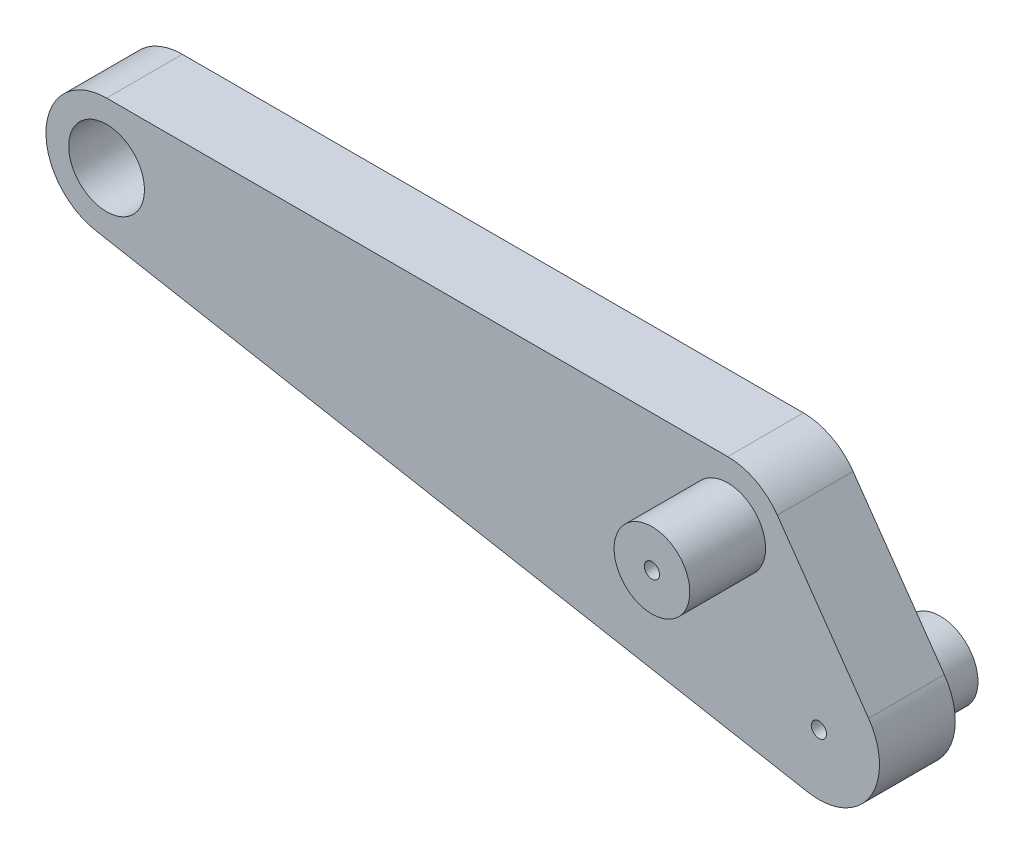
ISO-10303-21;
HEADER;
FILE_DESCRIPTION(('STEP AP214'),'2;1');
FILE_NAME('part.step','',(''),(''),'','','');
FILE_SCHEMA(('AUTOMOTIVE_DESIGN { 1 0 10303 214 1 1 1 1 }'));
ENDSEC;
DATA;
#1=APPLICATION_CONTEXT('core data for automotive mechanical design processes');
#2=APPLICATION_PROTOCOL_DEFINITION('international standard','automotive_design',2000,#1);
#3=PRODUCT_CONTEXT('',#1,'mechanical');
#4=PRODUCT('Part','Part','',(#3));
#5=PRODUCT_RELATED_PRODUCT_CATEGORY('part','',(#4));
#6=PRODUCT_DEFINITION_FORMATION('','',#4);
#7=PRODUCT_DEFINITION_CONTEXT('part definition',#1,'design');
#8=PRODUCT_DEFINITION('design','',#6,#7);
#9=PRODUCT_DEFINITION_SHAPE('','',#8);
#10=(LENGTH_UNIT() NAMED_UNIT(*) SI_UNIT(.MILLI.,.METRE.));
#11=(NAMED_UNIT(*) PLANE_ANGLE_UNIT() SI_UNIT($,.RADIAN.));
#12=(NAMED_UNIT(*) SI_UNIT($,.STERADIAN.) SOLID_ANGLE_UNIT());
#13=UNCERTAINTY_MEASURE_WITH_UNIT(LENGTH_MEASURE(1.E-05),#10,'distance_accuracy_value','');
#14=(GEOMETRIC_REPRESENTATION_CONTEXT(3) GLOBAL_UNCERTAINTY_ASSIGNED_CONTEXT((#13)) GLOBAL_UNIT_ASSIGNED_CONTEXT((#10,
#11,#12)) REPRESENTATION_CONTEXT('',''));
#15=CARTESIAN_POINT('',(0.,0.,0.));
#16=DIRECTION('',(0.,0.,1.));
#17=DIRECTION('',(1.,0.,0.));
#18=AXIS2_PLACEMENT_3D('',#15,#16,#17);
#19=CARTESIAN_POINT('',(0.,0.,5.));
#20=DIRECTION('',(0.,0.,1.));
#21=DIRECTION('',(1.,0.,0.));
#22=AXIS2_PLACEMENT_3D('',#19,#20,#21);
#23=PLANE('',#22);
#24=CARTESIAN_POINT('',(0.,0.,5.));
#25=DIRECTION('',(0.,0.,1.));
#26=DIRECTION('',(1.,0.,0.));
#27=AXIS2_PLACEMENT_3D('',#24,#25,#26);
#28=CIRCLE('',#27,2.5);
#29=CARTESIAN_POINT('',(2.5,0.,5.));
#30=VERTEX_POINT('',#29);
#31=EDGE_CURVE('E215',#30,#30,#28,.T.);
#32=ORIENTED_EDGE('',*,*,#31,.F.);
#33=EDGE_LOOP('',(#32));
#34=FACE_BOUND('',#33,.T.);
#35=CARTESIAN_POINT('',(0.,0.,5.));
#36=DIRECTION('',(0.,0.,1.));
#37=DIRECTION('',(1.,0.,0.));
#38=AXIS2_PLACEMENT_3D('',#35,#36,#37);
#39=CIRCLE('',#38,4.);
#40=CARTESIAN_POINT('',(3.27660817715596,2.2943057454042,5.));
#41=VERTEX_POINT('',#40);
#42=CARTESIAN_POINT('',(0.,4.,5.));
#43=VERTEX_POINT('',#42);
#44=EDGE_CURVE('E130',#41,#43,#39,.T.);
#45=ORIENTED_EDGE('',*,*,#44,.T.);
#46=DIRECTION('',(-1.,0.,0.));
#47=VECTOR('',#46,1.);
#48=CARTESIAN_POINT('',(-41.,3.99999999999999,5.));
#49=LINE('',#48,#47);
#50=CARTESIAN_POINT('',(-41.,3.99999999999999,5.));
#51=VERTEX_POINT('',#50);
#52=EDGE_CURVE('E88',#43,#51,#49,.T.);
#53=ORIENTED_EDGE('',*,*,#52,.T.);
#54=CARTESIAN_POINT('',(-41.,0.,5.));
#55=DIRECTION('',(0.,0.,1.));
#56=DIRECTION('',(1.,0.,0.));
#57=AXIS2_PLACEMENT_3D('',#54,#55,#56);
#58=CIRCLE('',#57,4.);
#59=CARTESIAN_POINT('',(-41.7197161864064,-3.9347183648928,5.));
#60=VERTEX_POINT('',#59);
#61=EDGE_CURVE('E101',#51,#60,#58,.T.);
#62=ORIENTED_EDGE('',*,*,#61,.T.);
#63=DIRECTION('',(0.983679591223199,-0.179929046601599,0.));
#64=VECTOR('',#63,1.);
#65=CARTESIAN_POINT('',(5.30283639527963,-12.5358148299272,5.));
#66=LINE('',#65,#64);
#67=CARTESIAN_POINT('',(5.30283639527963,-12.5358148299272,5.));
#68=VERTEX_POINT('',#67);
#69=EDGE_CURVE('E95',#60,#68,#66,.T.);
#70=ORIENTED_EDGE('',*,*,#69,.T.);
#71=CARTESIAN_POINT('',(6.02255258168603,-8.60109646503438,5.));
#72=DIRECTION('',(0.,0.,1.));
#73=DIRECTION('',(1.,0.,0.));
#74=AXIS2_PLACEMENT_3D('',#71,#72,#73);
#75=CIRCLE('',#74,4.);
#76=CARTESIAN_POINT('',(9.29916075884199,-6.30679071963019,5.));
#77=VERTEX_POINT('',#76);
#78=EDGE_CURVE('E99',#68,#77,#75,.T.);
#79=ORIENTED_EDGE('',*,*,#78,.T.);
#80=DIRECTION('',(-0.57357643635105,0.819152044288989,0.));
#81=VECTOR('',#80,1.);
#82=CARTESIAN_POINT('',(3.27660817715596,2.2943057454042,5.));
#83=LINE('',#82,#81);
#84=EDGE_CURVE('E51',#77,#41,#83,.T.);
#85=ORIENTED_EDGE('',*,*,#84,.T.);
#86=EDGE_LOOP('',(#45,#53,#62,#70,#79,#85));
#87=FACE_BOUND('',#86,.T.);
#88=CARTESIAN_POINT('',(-41.,0.,5.));
#89=DIRECTION('',(0.,0.,1.));
#90=DIRECTION('',(1.,0.,0.));
#91=AXIS2_PLACEMENT_3D('',#88,#89,#90);
#92=CIRCLE('',#91,2.5);
#93=CARTESIAN_POINT('',(-38.5,0.,5.));
#94=VERTEX_POINT('',#93);
#95=EDGE_CURVE('E123',#94,#94,#92,.T.);
#96=ORIENTED_EDGE('',*,*,#95,.F.);
#97=EDGE_LOOP('',(#96));
#98=FACE_BOUND('',#97,.T.);
#99=CARTESIAN_POINT('',(6.02255258168603,-8.60109646503438,5.));
#100=DIRECTION('',(0.,0.,1.));
#101=DIRECTION('',(1.,0.,0.));
#102=AXIS2_PLACEMENT_3D('',#99,#100,#101);
#103=CIRCLE('',#102,0.500000000000001);
#104=CARTESIAN_POINT('',(6.52255258168603,-8.60109646503438,5.));
#105=VERTEX_POINT('',#104);
#106=EDGE_CURVE('E203',#105,#105,#103,.T.);
#107=ORIENTED_EDGE('',*,*,#106,.F.);
#108=EDGE_LOOP('',(#107));
#109=FACE_BOUND('',#108,.T.);
#110=ADVANCED_FACE('F34',(#34,#87,#98,#109),#23,.T.);
#111=CARTESIAN_POINT('',(0.,0.,0.));
#112=DIRECTION('',(0.,0.,1.));
#113=DIRECTION('',(1.,0.,0.));
#114=AXIS2_PLACEMENT_3D('',#111,#112,#113);
#115=PLANE('',#114);
#116=CARTESIAN_POINT('',(0.,0.,0.));
#117=DIRECTION('',(0.,0.,1.));
#118=DIRECTION('',(1.,0.,0.));
#119=AXIS2_PLACEMENT_3D('',#116,#117,#118);
#120=CIRCLE('',#119,4.);
#121=CARTESIAN_POINT('',(3.27660817715596,2.2943057454042,0.));
#122=VERTEX_POINT('',#121);
#123=CARTESIAN_POINT('',(0.,4.,0.));
#124=VERTEX_POINT('',#123);
#125=EDGE_CURVE('E119',#122,#124,#120,.T.);
#126=ORIENTED_EDGE('',*,*,#125,.F.);
#127=DIRECTION('',(-0.57357643635105,0.819152044288989,0.));
#128=VECTOR('',#127,1.);
#129=CARTESIAN_POINT('',(3.27660817715596,2.2943057454042,0.));
#130=LINE('',#129,#128);
#131=CARTESIAN_POINT('',(9.29916075884199,-6.30679071963019,0.));
#132=VERTEX_POINT('',#131);
#133=EDGE_CURVE('E80',#132,#122,#130,.T.);
#134=ORIENTED_EDGE('',*,*,#133,.F.);
#135=CARTESIAN_POINT('',(6.02255258168603,-8.60109646503438,0.));
#136=DIRECTION('',(0.,0.,1.));
#137=DIRECTION('',(1.,0.,0.));
#138=AXIS2_PLACEMENT_3D('',#135,#136,#137);
#139=CIRCLE('',#138,4.);
#140=CARTESIAN_POINT('',(5.30283639527963,-12.5358148299272,0.));
#141=VERTEX_POINT('',#140);
#142=EDGE_CURVE('E74',#141,#132,#139,.T.);
#143=ORIENTED_EDGE('',*,*,#142,.F.);
#144=DIRECTION('',(0.983679591223199,-0.179929046601599,0.));
#145=VECTOR('',#144,1.);
#146=CARTESIAN_POINT('',(5.30283639527963,-12.5358148299272,0.));
#147=LINE('',#146,#145);
#148=CARTESIAN_POINT('',(-41.7197161864064,-3.9347183648928,0.));
#149=VERTEX_POINT('',#148);
#150=EDGE_CURVE('E109',#149,#141,#147,.T.);
#151=ORIENTED_EDGE('',*,*,#150,.F.);
#152=CARTESIAN_POINT('',(-41.,0.,0.));
#153=DIRECTION('',(0.,0.,1.));
#154=DIRECTION('',(1.,0.,0.));
#155=AXIS2_PLACEMENT_3D('',#152,#153,#154);
#156=CIRCLE('',#155,4.);
#157=CARTESIAN_POINT('',(-41.,3.99999999999999,0.));
#158=VERTEX_POINT('',#157);
#159=EDGE_CURVE('E125',#158,#149,#156,.T.);
#160=ORIENTED_EDGE('',*,*,#159,.F.);
#161=DIRECTION('',(-1.,0.,0.));
#162=VECTOR('',#161,1.);
#163=CARTESIAN_POINT('',(-41.,3.99999999999999,0.));
#164=LINE('',#163,#162);
#165=EDGE_CURVE('E122',#124,#158,#164,.T.);
#166=ORIENTED_EDGE('',*,*,#165,.F.);
#167=EDGE_LOOP('',(#126,#134,#143,#151,#160,#166));
#168=FACE_BOUND('',#167,.T.);
#169=CARTESIAN_POINT('',(-41.,0.,0.));
#170=DIRECTION('',(0.,0.,1.));
#171=DIRECTION('',(1.,0.,0.));
#172=AXIS2_PLACEMENT_3D('',#169,#170,#171);
#173=CIRCLE('',#172,2.5);
#174=CARTESIAN_POINT('',(-38.5,0.,0.));
#175=VERTEX_POINT('',#174);
#176=EDGE_CURVE('E218',#175,#175,#173,.T.);
#177=ORIENTED_EDGE('',*,*,#176,.T.);
#178=EDGE_LOOP('',(#177));
#179=FACE_BOUND('',#178,.T.);
#180=CARTESIAN_POINT('',(6.02255258168603,-8.60109646503438,0.));
#181=DIRECTION('',(0.,0.,1.));
#182=DIRECTION('',(1.,0.,0.));
#183=AXIS2_PLACEMENT_3D('',#180,#181,#182);
#184=CIRCLE('',#183,2.5);
#185=CARTESIAN_POINT('',(8.52255258168603,-8.60109646503438,0.));
#186=VERTEX_POINT('',#185);
#187=EDGE_CURVE('E212',#186,#186,#184,.T.);
#188=ORIENTED_EDGE('',*,*,#187,.T.);
#189=EDGE_LOOP('',(#188));
#190=FACE_BOUND('',#189,.T.);
#191=CARTESIAN_POINT('',(0.,0.,0.));
#192=DIRECTION('',(0.,0.,-1.));
#193=DIRECTION('',(-1.,0.,0.));
#194=AXIS2_PLACEMENT_3D('',#191,#192,#193);
#195=CIRCLE('',#194,0.5);
#196=CARTESIAN_POINT('',(-0.5,0.,0.));
#197=VERTEX_POINT('',#196);
#198=EDGE_CURVE('E195',#197,#197,#195,.T.);
#199=ORIENTED_EDGE('',*,*,#198,.F.);
#200=EDGE_LOOP('',(#199));
#201=FACE_BOUND('',#200,.T.);
#202=ADVANCED_FACE('F139',(#168,#179,#190,#201),#115,.F.);
#203=CARTESIAN_POINT('',(0.,0.,5.));
#204=DIRECTION('',(0.,0.,-1.));
#205=DIRECTION('',(-1.,0.,0.));
#206=AXIS2_PLACEMENT_3D('',#203,#204,#205);
#207=CYLINDRICAL_SURFACE('',#206,4.);
#208=ORIENTED_EDGE('',*,*,#125,.T.);
#209=DIRECTION('',(0.,0.,-1.));
#210=VECTOR('',#209,1.);
#211=CARTESIAN_POINT('',(0.,4.,5.));
#212=LINE('',#211,#210);
#213=EDGE_CURVE('E11',#43,#124,#212,.T.);
#214=ORIENTED_EDGE('',*,*,#213,.F.);
#215=ORIENTED_EDGE('',*,*,#44,.F.);
#216=DIRECTION('',(0.,0.,-1.));
#217=VECTOR('',#216,1.);
#218=CARTESIAN_POINT('',(3.27660817715596,2.2943057454042,5.));
#219=LINE('',#218,#217);
#220=EDGE_CURVE('E115',#41,#122,#219,.T.);
#221=ORIENTED_EDGE('',*,*,#220,.T.);
#222=EDGE_LOOP('',(#208,#214,#215,#221));
#223=FACE_BOUND('',#222,.T.);
#224=ADVANCED_FACE('F36',(#223),#207,.T.);
#225=CARTESIAN_POINT('',(-41.,3.99999999999999,5.));
#226=DIRECTION('',(0.,-1.,0.));
#227=DIRECTION('',(1.,0.,0.));
#228=AXIS2_PLACEMENT_3D('',#225,#226,#227);
#229=PLANE('',#228);
#230=ORIENTED_EDGE('',*,*,#165,.T.);
#231=DIRECTION('',(0.,0.,-1.));
#232=VECTOR('',#231,1.);
#233=CARTESIAN_POINT('',(-41.,3.99999999999999,5.));
#234=LINE('',#233,#232);
#235=EDGE_CURVE('E43',#51,#158,#234,.T.);
#236=ORIENTED_EDGE('',*,*,#235,.F.);
#237=ORIENTED_EDGE('',*,*,#52,.F.);
#238=ORIENTED_EDGE('',*,*,#213,.T.);
#239=EDGE_LOOP('',(#230,#236,#237,#238));
#240=FACE_BOUND('',#239,.T.);
#241=ADVANCED_FACE('F303',(#240),#229,.F.);
#242=CARTESIAN_POINT('',(-41.,0.,5.));
#243=DIRECTION('',(0.,0.,-1.));
#244=DIRECTION('',(-1.,0.,0.));
#245=AXIS2_PLACEMENT_3D('',#242,#243,#244);
#246=CYLINDRICAL_SURFACE('',#245,4.);
#247=ORIENTED_EDGE('',*,*,#159,.T.);
#248=DIRECTION('',(0.,0.,-1.));
#249=VECTOR('',#248,1.);
#250=CARTESIAN_POINT('',(-41.7197161864064,-3.9347183648928,5.));
#251=LINE('',#250,#249);
#252=EDGE_CURVE('E110',#60,#149,#251,.T.);
#253=ORIENTED_EDGE('',*,*,#252,.F.);
#254=ORIENTED_EDGE('',*,*,#61,.F.);
#255=ORIENTED_EDGE('',*,*,#235,.T.);
#256=EDGE_LOOP('',(#247,#253,#254,#255));
#257=FACE_BOUND('',#256,.T.);
#258=ADVANCED_FACE('F136',(#257),#246,.T.);
#259=CARTESIAN_POINT('',(5.30283639527963,-12.5358148299272,5.));
#260=DIRECTION('',(0.179929046601599,0.983679591223199,0.));
#261=DIRECTION('',(-0.983679591223199,0.179929046601599,0.));
#262=AXIS2_PLACEMENT_3D('',#259,#260,#261);
#263=PLANE('',#262);
#264=ORIENTED_EDGE('',*,*,#150,.T.);
#265=DIRECTION('',(0.,0.,-1.));
#266=VECTOR('',#265,1.);
#267=CARTESIAN_POINT('',(5.30283639527963,-12.5358148299272,5.));
#268=LINE('',#267,#266);
#269=EDGE_CURVE('E106',#68,#141,#268,.T.);
#270=ORIENTED_EDGE('',*,*,#269,.F.);
#271=ORIENTED_EDGE('',*,*,#69,.F.);
#272=ORIENTED_EDGE('',*,*,#252,.T.);
#273=EDGE_LOOP('',(#264,#270,#271,#272));
#274=FACE_BOUND('',#273,.T.);
#275=ADVANCED_FACE('F107',(#274),#263,.F.);
#276=CARTESIAN_POINT('',(6.02255258168603,-8.60109646503438,5.));
#277=DIRECTION('',(0.,0.,-1.));
#278=DIRECTION('',(-1.,0.,0.));
#279=AXIS2_PLACEMENT_3D('',#276,#277,#278);
#280=CYLINDRICAL_SURFACE('',#279,4.);
#281=ORIENTED_EDGE('',*,*,#142,.T.);
#282=DIRECTION('',(0.,0.,-1.));
#283=VECTOR('',#282,1.);
#284=CARTESIAN_POINT('',(9.29916075884199,-6.30679071963019,5.));
#285=LINE('',#284,#283);
#286=EDGE_CURVE('E111',#77,#132,#285,.T.);
#287=ORIENTED_EDGE('',*,*,#286,.F.);
#288=ORIENTED_EDGE('',*,*,#78,.F.);
#289=ORIENTED_EDGE('',*,*,#269,.T.);
#290=EDGE_LOOP('',(#281,#287,#288,#289));
#291=FACE_BOUND('',#290,.T.);
#292=ADVANCED_FACE('F113',(#291),#280,.T.);
#293=CARTESIAN_POINT('',(3.27660817715596,2.2943057454042,5.));
#294=DIRECTION('',(-0.819152044288989,-0.57357643635105,0.));
#295=DIRECTION('',(0.57357643635105,-0.819152044288989,0.));
#296=AXIS2_PLACEMENT_3D('',#293,#294,#295);
#297=PLANE('',#296);
#298=ORIENTED_EDGE('',*,*,#133,.T.);
#299=ORIENTED_EDGE('',*,*,#220,.F.);
#300=ORIENTED_EDGE('',*,*,#84,.F.);
#301=ORIENTED_EDGE('',*,*,#286,.T.);
#302=EDGE_LOOP('',(#298,#299,#300,#301));
#303=FACE_BOUND('',#302,.T.);
#304=ADVANCED_FACE('F144',(#303),#297,.F.);
#305=CARTESIAN_POINT('',(-41.,0.,5.));
#306=DIRECTION('',(0.,0.,-1.));
#307=DIRECTION('',(-1.,0.,0.));
#308=AXIS2_PLACEMENT_3D('',#305,#306,#307);
#309=CYLINDRICAL_SURFACE('',#308,2.5);
#310=ORIENTED_EDGE('',*,*,#95,.T.);
#311=EDGE_LOOP('',(#310));
#312=FACE_BOUND('',#311,.T.);
#313=ORIENTED_EDGE('',*,*,#176,.F.);
#314=EDGE_LOOP('',(#313));
#315=FACE_BOUND('',#314,.T.);
#316=ADVANCED_FACE('F146',(#312,#315),#309,.F.);
#317=CARTESIAN_POINT('',(6.02255258168603,-8.60109646503438,-3.));
#318=DIRECTION('',(0.,0.,1.));
#319=DIRECTION('',(1.,0.,0.));
#320=AXIS2_PLACEMENT_3D('',#317,#318,#319);
#321=CYLINDRICAL_SURFACE('',#320,2.5);
#322=CARTESIAN_POINT('',(6.02255258168603,-8.60109646503438,-3.));
#323=DIRECTION('',(0.,0.,1.));
#324=DIRECTION('',(1.,0.,0.));
#325=AXIS2_PLACEMENT_3D('',#322,#323,#324);
#326=CIRCLE('',#325,2.5);
#327=CARTESIAN_POINT('',(8.52255258168603,-8.60109646503438,-3.));
#328=VERTEX_POINT('',#327);
#329=EDGE_CURVE('E207',#328,#328,#326,.T.);
#330=ORIENTED_EDGE('',*,*,#329,.T.);
#331=EDGE_LOOP('',(#330));
#332=FACE_BOUND('',#331,.T.);
#333=ORIENTED_EDGE('',*,*,#187,.F.);
#334=EDGE_LOOP('',(#333));
#335=FACE_BOUND('',#334,.T.);
#336=ADVANCED_FACE('F152',(#332,#335),#321,.T.);
#337=CARTESIAN_POINT('',(6.02255258168603,-8.60109646503438,-3.));
#338=DIRECTION('',(0.,0.,1.));
#339=DIRECTION('',(1.,0.,0.));
#340=AXIS2_PLACEMENT_3D('',#337,#338,#339);
#341=PLANE('',#340);
#342=CARTESIAN_POINT('',(6.02255258168603,-8.60109646503438,-3.));
#343=DIRECTION('',(0.,0.,1.));
#344=DIRECTION('',(1.,0.,0.));
#345=AXIS2_PLACEMENT_3D('',#342,#343,#344);
#346=CIRCLE('',#345,0.500000000000001);
#347=CARTESIAN_POINT('',(6.52255258168603,-8.60109646503438,-3.));
#348=VERTEX_POINT('',#347);
#349=EDGE_CURVE('E204',#348,#348,#346,.T.);
#350=ORIENTED_EDGE('',*,*,#349,.T.);
#351=EDGE_LOOP('',(#350));
#352=FACE_BOUND('',#351,.T.);
#353=ORIENTED_EDGE('',*,*,#329,.F.);
#354=EDGE_LOOP('',(#353));
#355=FACE_BOUND('',#354,.T.);
#356=ADVANCED_FACE('F167',(#352,#355),#341,.F.);
#357=CARTESIAN_POINT('',(6.02255258168603,-8.60109646503438,-3.));
#358=DIRECTION('',(0.,0.,1.));
#359=DIRECTION('',(1.,0.,0.));
#360=AXIS2_PLACEMENT_3D('',#357,#358,#359);
#361=CYLINDRICAL_SURFACE('',#360,0.500000000000001);
#362=ORIENTED_EDGE('',*,*,#349,.F.);
#363=EDGE_LOOP('',(#362));
#364=FACE_BOUND('',#363,.T.);
#365=ORIENTED_EDGE('',*,*,#106,.T.);
#366=EDGE_LOOP('',(#365));
#367=FACE_BOUND('',#366,.T.);
#368=ADVANCED_FACE('F171',(#364,#367),#361,.F.);
#369=CARTESIAN_POINT('',(0.,0.,10.));
#370=DIRECTION('',(0.,0.,-1.));
#371=DIRECTION('',(-1.,0.,0.));
#372=AXIS2_PLACEMENT_3D('',#369,#370,#371);
#373=CYLINDRICAL_SURFACE('',#372,2.5);
#374=ORIENTED_EDGE('',*,*,#31,.T.);
#375=EDGE_LOOP('',(#374));
#376=FACE_BOUND('',#375,.T.);
#377=CARTESIAN_POINT('',(0.,0.,10.));
#378=DIRECTION('',(0.,0.,-1.));
#379=DIRECTION('',(-1.,0.,0.));
#380=AXIS2_PLACEMENT_3D('',#377,#378,#379);
#381=CIRCLE('',#380,2.5);
#382=CARTESIAN_POINT('',(-2.5,0.,10.));
#383=VERTEX_POINT('',#382);
#384=EDGE_CURVE('E198',#383,#383,#381,.T.);
#385=ORIENTED_EDGE('',*,*,#384,.T.);
#386=EDGE_LOOP('',(#385));
#387=FACE_BOUND('',#386,.T.);
#388=ADVANCED_FACE('F175',(#376,#387),#373,.T.);
#389=CARTESIAN_POINT('',(0.,0.,10.));
#390=DIRECTION('',(0.,0.,-1.));
#391=DIRECTION('',(-1.,0.,0.));
#392=AXIS2_PLACEMENT_3D('',#389,#390,#391);
#393=PLANE('',#392);
#394=CARTESIAN_POINT('',(0.,0.,10.));
#395=DIRECTION('',(0.,0.,-1.));
#396=DIRECTION('',(-1.,0.,0.));
#397=AXIS2_PLACEMENT_3D('',#394,#395,#396);
#398=CIRCLE('',#397,0.5);
#399=CARTESIAN_POINT('',(-0.5,0.,10.));
#400=VERTEX_POINT('',#399);
#401=EDGE_CURVE('E192',#400,#400,#398,.T.);
#402=ORIENTED_EDGE('',*,*,#401,.T.);
#403=EDGE_LOOP('',(#402));
#404=FACE_BOUND('',#403,.T.);
#405=ORIENTED_EDGE('',*,*,#384,.F.);
#406=EDGE_LOOP('',(#405));
#407=FACE_BOUND('',#406,.T.);
#408=ADVANCED_FACE('F179',(#404,#407),#393,.F.);
#409=CARTESIAN_POINT('',(0.,0.,10.));
#410=DIRECTION('',(0.,0.,-1.));
#411=DIRECTION('',(-1.,0.,0.));
#412=AXIS2_PLACEMENT_3D('',#409,#410,#411);
#413=CYLINDRICAL_SURFACE('',#412,0.5);
#414=ORIENTED_EDGE('',*,*,#401,.F.);
#415=EDGE_LOOP('',(#414));
#416=FACE_BOUND('',#415,.T.);
#417=ORIENTED_EDGE('',*,*,#198,.T.);
#418=EDGE_LOOP('',(#417));
#419=FACE_BOUND('',#418,.T.);
#420=ADVANCED_FACE('F183',(#416,#419),#413,.F.);
#421=CLOSED_SHELL('',(#110,#202,#224,#241,#258,#275,#292,#304,#316,#336,#356,#368,#388,#408,#420));
#422=MANIFOLD_SOLID_BREP('B2',#421);
#423=ADVANCED_BREP_SHAPE_REPRESENTATION('',(#18,#422),#14);
#424=SHAPE_DEFINITION_REPRESENTATION(#9,#423);
ENDSEC;
END-ISO-10303-21;
